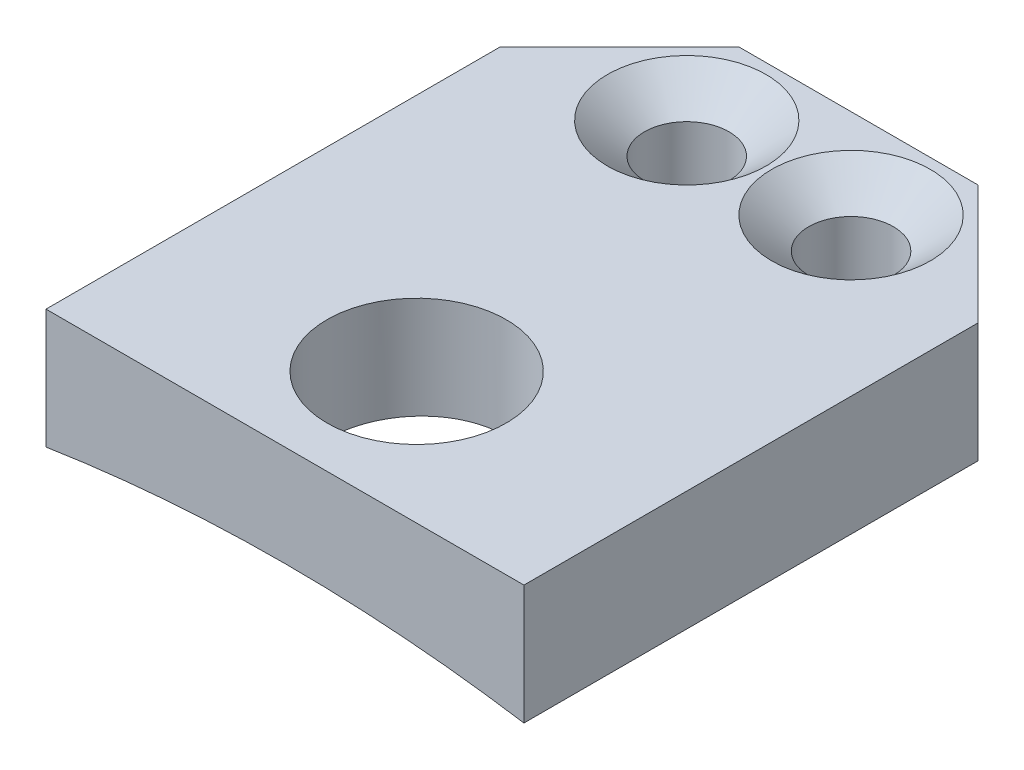
ISO-10303-21;
HEADER;
FILE_DESCRIPTION(('STEP AP214'),'2;1');
FILE_NAME('part.step','',(''),(''),'','','');
FILE_SCHEMA(('AUTOMOTIVE_DESIGN { 1 0 10303 214 1 1 1 1 }'));
ENDSEC;
DATA;
#1=APPLICATION_CONTEXT('core data for automotive mechanical design processes');
#2=APPLICATION_PROTOCOL_DEFINITION('international standard','automotive_design',2000,#1);
#3=PRODUCT_CONTEXT('',#1,'mechanical');
#4=PRODUCT('Part','Part','',(#3));
#5=PRODUCT_RELATED_PRODUCT_CATEGORY('part','',(#4));
#6=PRODUCT_DEFINITION_FORMATION('','',#4);
#7=PRODUCT_DEFINITION_CONTEXT('part definition',#1,'design');
#8=PRODUCT_DEFINITION('design','',#6,#7);
#9=PRODUCT_DEFINITION_SHAPE('','',#8);
#10=(LENGTH_UNIT() NAMED_UNIT(*) SI_UNIT(.MILLI.,.METRE.));
#11=(NAMED_UNIT(*) PLANE_ANGLE_UNIT() SI_UNIT($,.RADIAN.));
#12=(NAMED_UNIT(*) SI_UNIT($,.STERADIAN.) SOLID_ANGLE_UNIT());
#13=UNCERTAINTY_MEASURE_WITH_UNIT(LENGTH_MEASURE(1.E-05),#10,'distance_accuracy_value','');
#14=(GEOMETRIC_REPRESENTATION_CONTEXT(3) GLOBAL_UNCERTAINTY_ASSIGNED_CONTEXT((#13)) GLOBAL_UNIT_ASSIGNED_CONTEXT((#10,
#11,#12)) REPRESENTATION_CONTEXT('',''));
#15=CARTESIAN_POINT('',(0.,0.,0.));
#16=DIRECTION('',(0.,0.,1.));
#17=DIRECTION('',(1.,0.,0.));
#18=AXIS2_PLACEMENT_3D('',#15,#16,#17);
#19=CARTESIAN_POINT('',(-9.46182569861947,6.35,-17.9252711134383));
#20=DIRECTION('',(-0.707106781186547,0.,0.707106781186548));
#21=DIRECTION('',(0.707106781186548,0.,0.707106781186547));
#22=AXIS2_PLACEMENT_3D('',#19,#20,#21);
#23=PLANE('',#22);
#24=DIRECTION('',(0.,-1.,0.));
#25=VECTOR('',#24,1.);
#26=CARTESIAN_POINT('',(-3.11182569861947,6.35,-11.5752711134383));
#27=LINE('',#26,#25);
#28=CARTESIAN_POINT('',(-3.11182569861947,6.35,-11.5752711134383));
#29=VERTEX_POINT('',#28);
#30=CARTESIAN_POINT('',(-3.11182569861947,0.,-11.5752711134383));
#31=VERTEX_POINT('',#30);
#32=EDGE_CURVE('E106',#29,#31,#27,.T.);
#33=ORIENTED_EDGE('',*,*,#32,.T.);
#34=CARTESIAN_POINT('',(-15.8118256986195,-81.0530675792101,-24.2752711134383));
#35=DIRECTION('',(-0.707106781186547,0.,0.707106781186548));
#36=DIRECTION('',(0.707106781186548,0.,0.707106781186547));
#37=AXIS2_PLACEMENT_3D('',#34,#35,#36);
#38=ELLIPSE('',#37,116.024909084213,82.042);
#39=CARTESIAN_POINT('',(-9.46182569861947,0.742820239188202,-17.9252711134383));
#40=VERTEX_POINT('',#39);
#41=EDGE_CURVE('E92',#31,#40,#38,.T.);
#42=ORIENTED_EDGE('',*,*,#41,.T.);
#43=DIRECTION('',(0.,-1.,0.));
#44=VECTOR('',#43,1.);
#45=CARTESIAN_POINT('',(-9.46182569861947,6.35,-17.9252711134383));
#46=LINE('',#45,#44);
#47=CARTESIAN_POINT('',(-9.46182569861947,6.35,-17.9252711134383));
#48=VERTEX_POINT('',#47);
#49=EDGE_CURVE('E11',#48,#40,#46,.T.);
#50=ORIENTED_EDGE('',*,*,#49,.F.);
#51=DIRECTION('',(-0.707106781186548,0.,-0.707106781186547));
#52=VECTOR('',#51,1.);
#53=CARTESIAN_POINT('',(-9.46182569861947,6.35,-17.9252711134383));
#54=LINE('',#53,#52);
#55=EDGE_CURVE('E113',#29,#48,#54,.T.);
#56=ORIENTED_EDGE('',*,*,#55,.F.);
#57=EDGE_LOOP('',(#33,#42,#50,#56));
#58=FACE_BOUND('',#57,.T.);
#59=ADVANCED_FACE('F35',(#58),#23,.F.);
#60=CARTESIAN_POINT('',(-22.1618256986195,6.35,-17.9252711134383));
#61=DIRECTION('',(0.,0.,1.));
#62=DIRECTION('',(1.,0.,0.));
#63=AXIS2_PLACEMENT_3D('',#60,#61,#62);
#64=PLANE('',#63);
#65=ORIENTED_EDGE('',*,*,#49,.T.);
#66=CARTESIAN_POINT('',(-15.8118256986195,-81.0530675792101,-17.9252711134383));
#67=DIRECTION('',(0.,0.,1.));
#68=DIRECTION('',(1.,0.,0.));
#69=AXIS2_PLACEMENT_3D('',#66,#67,#68);
#70=CIRCLE('',#69,82.042);
#71=CARTESIAN_POINT('',(-22.1618256986195,0.742820239188202,-17.9252711134383));
#72=VERTEX_POINT('',#71);
#73=EDGE_CURVE('E89',#40,#72,#70,.T.);
#74=ORIENTED_EDGE('',*,*,#73,.T.);
#75=DIRECTION('',(0.,-1.,0.));
#76=VECTOR('',#75,1.);
#77=CARTESIAN_POINT('',(-22.1618256986195,6.35,-17.9252711134383));
#78=LINE('',#77,#76);
#79=CARTESIAN_POINT('',(-22.1618256986195,6.35,-17.9252711134383));
#80=VERTEX_POINT('',#79);
#81=EDGE_CURVE('E48',#80,#72,#78,.T.);
#82=ORIENTED_EDGE('',*,*,#81,.F.);
#83=DIRECTION('',(-1.,0.,0.));
#84=VECTOR('',#83,1.);
#85=CARTESIAN_POINT('',(-22.1618256986195,6.35,-17.9252711134383));
#86=LINE('',#85,#84);
#87=EDGE_CURVE('E110',#48,#80,#86,.T.);
#88=ORIENTED_EDGE('',*,*,#87,.F.);
#89=EDGE_LOOP('',(#65,#74,#82,#88));
#90=FACE_BOUND('',#89,.T.);
#91=ADVANCED_FACE('F109',(#90),#64,.F.);
#92=CARTESIAN_POINT('',(-28.5118256986195,6.35,-11.5752711134383));
#93=DIRECTION('',(0.707106781186547,0.,0.707106781186548));
#94=DIRECTION('',(0.707106781186548,0.,-0.707106781186547));
#95=AXIS2_PLACEMENT_3D('',#92,#93,#94);
#96=PLANE('',#95);
#97=ORIENTED_EDGE('',*,*,#81,.T.);
#98=CARTESIAN_POINT('',(-15.8118256986195,-81.0530675792101,-24.2752711134383));
#99=DIRECTION('',(0.707106781186547,0.,0.707106781186548));
#100=DIRECTION('',(-0.707106781186548,0.,0.707106781186547));
#101=AXIS2_PLACEMENT_3D('',#98,#99,#100);
#102=ELLIPSE('',#101,116.024909084213,82.042);
#103=CARTESIAN_POINT('',(-28.5118256986195,0.,-11.5752711134383));
#104=VERTEX_POINT('',#103);
#105=EDGE_CURVE('E95',#72,#104,#102,.T.);
#106=ORIENTED_EDGE('',*,*,#105,.T.);
#107=DIRECTION('',(0.,-1.,0.));
#108=VECTOR('',#107,1.);
#109=CARTESIAN_POINT('',(-28.5118256986195,6.35,-11.5752711134383));
#110=LINE('',#109,#108);
#111=CARTESIAN_POINT('',(-28.5118256986195,6.35,-11.5752711134383));
#112=VERTEX_POINT('',#111);
#113=EDGE_CURVE('E139',#112,#104,#110,.T.);
#114=ORIENTED_EDGE('',*,*,#113,.F.);
#115=DIRECTION('',(-0.707106781186548,0.,0.707106781186547));
#116=VECTOR('',#115,1.);
#117=CARTESIAN_POINT('',(-28.5118256986195,6.35,-11.5752711134383));
#118=LINE('',#117,#116);
#119=EDGE_CURVE('E112',#80,#112,#118,.T.);
#120=ORIENTED_EDGE('',*,*,#119,.F.);
#121=EDGE_LOOP('',(#97,#106,#114,#120));
#122=FACE_BOUND('',#121,.T.);
#123=ADVANCED_FACE('F185',(#122),#96,.F.);
#124=CARTESIAN_POINT('',(-28.5118256986195,6.35,-11.5752711134383));
#125=DIRECTION('',(1.,0.,0.));
#126=DIRECTION('',(0.,0.,-1.));
#127=AXIS2_PLACEMENT_3D('',#124,#125,#126);
#128=PLANE('',#127);
#129=DIRECTION('',(0.,0.,1.));
#130=VECTOR('',#129,1.);
#131=CARTESIAN_POINT('',(-28.5118256986195,0.,-11.5752711134383));
#132=LINE('',#131,#130);
#133=CARTESIAN_POINT('',(-28.5118256986195,0.,12.5547288865617));
#134=VERTEX_POINT('',#133);
#135=EDGE_CURVE('E118',#104,#134,#132,.T.);
#136=ORIENTED_EDGE('',*,*,#135,.T.);
#137=DIRECTION('',(0.,-1.,0.));
#138=VECTOR('',#137,1.);
#139=CARTESIAN_POINT('',(-28.5118256986195,6.35,12.5547288865617));
#140=LINE('',#139,#138);
#141=CARTESIAN_POINT('',(-28.5118256986195,6.35,12.5547288865617));
#142=VERTEX_POINT('',#141);
#143=EDGE_CURVE('E136',#142,#134,#140,.T.);
#144=ORIENTED_EDGE('',*,*,#143,.F.);
#145=DIRECTION('',(0.,0.,1.));
#146=VECTOR('',#145,1.);
#147=CARTESIAN_POINT('',(-28.5118256986195,6.35,-11.5752711134383));
#148=LINE('',#147,#146);
#149=EDGE_CURVE('E125',#112,#142,#148,.T.);
#150=ORIENTED_EDGE('',*,*,#149,.F.);
#151=ORIENTED_EDGE('',*,*,#113,.T.);
#152=EDGE_LOOP('',(#136,#144,#150,#151));
#153=FACE_BOUND('',#152,.T.);
#154=ADVANCED_FACE('F181',(#153),#128,.F.);
#155=CARTESIAN_POINT('',(-28.5118256986195,6.35,12.5547288865617));
#156=DIRECTION('',(0.,0.,-1.));
#157=DIRECTION('',(-1.,0.,0.));
#158=AXIS2_PLACEMENT_3D('',#155,#156,#157);
#159=PLANE('',#158);
#160=ORIENTED_EDGE('',*,*,#143,.T.);
#161=CARTESIAN_POINT('',(-15.8118256986195,-81.0530675792101,12.5547288865617));
#162=DIRECTION('',(0.,0.,1.));
#163=DIRECTION('',(1.,0.,0.));
#164=AXIS2_PLACEMENT_3D('',#161,#162,#163);
#165=CIRCLE('',#164,82.042);
#166=CARTESIAN_POINT('',(-3.11182569861945,0.,12.5547288865617));
#167=VERTEX_POINT('',#166);
#168=EDGE_CURVE('E100',#167,#134,#165,.T.);
#169=ORIENTED_EDGE('',*,*,#168,.F.);
#170=DIRECTION('',(0.,-1.,0.));
#171=VECTOR('',#170,1.);
#172=CARTESIAN_POINT('',(-3.11182569861948,6.35,12.5547288865617));
#173=LINE('',#172,#171);
#174=CARTESIAN_POINT('',(-3.11182569861948,6.35,12.5547288865617));
#175=VERTEX_POINT('',#174);
#176=EDGE_CURVE('E133',#175,#167,#173,.T.);
#177=ORIENTED_EDGE('',*,*,#176,.F.);
#178=DIRECTION('',(1.,0.,0.));
#179=VECTOR('',#178,1.);
#180=CARTESIAN_POINT('',(-28.5118256986195,6.35,12.5547288865617));
#181=LINE('',#180,#179);
#182=EDGE_CURVE('E127',#142,#175,#181,.T.);
#183=ORIENTED_EDGE('',*,*,#182,.F.);
#184=EDGE_LOOP('',(#160,#169,#177,#183));
#185=FACE_BOUND('',#184,.T.);
#186=ADVANCED_FACE('F177',(#185),#159,.F.);
#187=CARTESIAN_POINT('',(-3.11182569861947,6.35,-11.5752711134383));
#188=DIRECTION('',(-1.,0.,0.));
#189=DIRECTION('',(0.,0.,1.));
#190=AXIS2_PLACEMENT_3D('',#187,#188,#189);
#191=PLANE('',#190);
#192=DIRECTION('',(0.,0.,-1.));
#193=VECTOR('',#192,1.);
#194=CARTESIAN_POINT('',(-3.11182569861947,0.,-11.5752711134383));
#195=LINE('',#194,#193);
#196=EDGE_CURVE('E116',#167,#31,#195,.T.);
#197=ORIENTED_EDGE('',*,*,#196,.T.);
#198=ORIENTED_EDGE('',*,*,#32,.F.);
#199=DIRECTION('',(0.,0.,-1.));
#200=VECTOR('',#199,1.);
#201=CARTESIAN_POINT('',(-3.11182569861947,6.35,-11.5752711134383));
#202=LINE('',#201,#200);
#203=EDGE_CURVE('E56',#175,#29,#202,.T.);
#204=ORIENTED_EDGE('',*,*,#203,.F.);
#205=ORIENTED_EDGE('',*,*,#176,.T.);
#206=EDGE_LOOP('',(#197,#198,#204,#205));
#207=FACE_BOUND('',#206,.T.);
#208=ADVANCED_FACE('F173',(#207),#191,.F.);
#209=CARTESIAN_POINT('',(0.,6.35,0.));
#210=DIRECTION('',(0.,1.,0.));
#211=DIRECTION('',(0.,0.,1.));
#212=AXIS2_PLACEMENT_3D('',#209,#210,#211);
#213=PLANE('',#212);
#214=CARTESIAN_POINT('',(-15.7993805032458,6.35,5.5697288865617));
#215=DIRECTION('',(0.,1.,0.));
#216=DIRECTION('',(0.,0.,1.));
#217=AXIS2_PLACEMENT_3D('',#214,#215,#216);
#218=CIRCLE('',#217,4.7625);
#219=CARTESIAN_POINT('',(-15.7993805032458,6.35,10.3322288865617));
#220=VERTEX_POINT('',#219);
#221=EDGE_CURVE('E273',#220,#220,#218,.T.);
#222=ORIENTED_EDGE('',*,*,#221,.F.);
#223=EDGE_LOOP('',(#222));
#224=FACE_BOUND('',#223,.T.);
#225=CARTESIAN_POINT('',(-20.1774506986195,6.35,-13.1627711134383));
#226=DIRECTION('',(0.,1.,0.));
#227=DIRECTION('',(0.,0.,1.));
#228=AXIS2_PLACEMENT_3D('',#225,#226,#227);
#229=CIRCLE('',#228,4.2164);
#230=CARTESIAN_POINT('',(-20.1774506986195,6.35,-8.94637111343829));
#231=VERTEX_POINT('',#230);
#232=EDGE_CURVE('E283',#231,#231,#229,.T.);
#233=ORIENTED_EDGE('',*,*,#232,.F.);
#234=EDGE_LOOP('',(#233));
#235=FACE_BOUND('',#234,.T.);
#236=CARTESIAN_POINT('',(-11.4462006986195,6.35,-13.1627711134383));
#237=DIRECTION('',(0.,1.,0.));
#238=DIRECTION('',(0.,0.,1.));
#239=AXIS2_PLACEMENT_3D('',#236,#237,#238);
#240=CIRCLE('',#239,4.2164);
#241=CARTESIAN_POINT('',(-11.4462006986195,6.35,-8.94637111343829));
#242=VERTEX_POINT('',#241);
#243=EDGE_CURVE('E289',#242,#242,#240,.T.);
#244=ORIENTED_EDGE('',*,*,#243,.F.);
#245=EDGE_LOOP('',(#244));
#246=FACE_BOUND('',#245,.T.);
#247=ORIENTED_EDGE('',*,*,#55,.T.);
#248=ORIENTED_EDGE('',*,*,#87,.T.);
#249=ORIENTED_EDGE('',*,*,#119,.T.);
#250=ORIENTED_EDGE('',*,*,#149,.T.);
#251=ORIENTED_EDGE('',*,*,#182,.T.);
#252=ORIENTED_EDGE('',*,*,#203,.T.);
#253=EDGE_LOOP('',(#247,#248,#249,#250,#251,#252));
#254=FACE_BOUND('',#253,.T.);
#255=ADVANCED_FACE('F115',(#224,#235,#246,#254),#213,.T.);
#256=CARTESIAN_POINT('',(-11.4462006986195,6.35,-13.1627711134383));
#257=DIRECTION('',(0.,1.,0.));
#258=DIRECTION('',(0.,0.,1.));
#259=AXIS2_PLACEMENT_3D('',#256,#257,#258);
#260=CYLINDRICAL_SURFACE('',#259,2.2479);
#261=CARTESIAN_POINT('',(-11.4462006986195,0.872698101431396,-10.9148711134383));
#262=CARTESIAN_POINT('',(-11.5724581183139,0.879425637600338,-10.9148766645662));
#263=CARTESIAN_POINT('',(-11.6988214219175,0.885863819395868,-10.9255436844624));
#264=CARTESIAN_POINT('',(-11.9481006299543,0.897997193573876,-10.9679655683311));
#265=CARTESIAN_POINT('',(-12.0710122927471,0.903691500717502,-10.9997452885172));
#266=CARTESIAN_POINT('',(-12.30974180428,0.914239587095616,-11.0835070036873));
#267=CARTESIAN_POINT('',(-12.4255625844459,0.919093715203898,-11.1354805841939));
#268=CARTESIAN_POINT('',(-12.6468185887368,0.9279349093391,-11.2581529692462));
#269=CARTESIAN_POINT('',(-12.7522563614403,0.931922188431547,-11.3288471628969));
#270=CARTESIAN_POINT('',(-12.9496916637995,0.93905229089963,-11.4868994293524));
#271=CARTESIAN_POINT('',(-13.0417000331939,0.942195797077884,-11.5742439298104));
#272=CARTESIAN_POINT('',(-13.209756100012,0.947701234511881,-11.7631602612973));
#273=CARTESIAN_POINT('',(-13.285803235907,0.950063138271924,-11.8647325926628));
#274=CARTESIAN_POINT('',(-13.419720203529,0.954079043997791,-12.0791467827732));
#275=CARTESIAN_POINT('',(-13.4776017587191,0.955733502776102,-12.191981311032));
#276=CARTESIAN_POINT('',(-13.5736061569461,0.95841001380811,-12.4257711213163));
#277=CARTESIAN_POINT('',(-13.6117290600956,0.959432067985798,-12.5467263786346));
#278=CARTESIAN_POINT('',(-13.6671269050084,0.960899566762265,-12.79330381664));
#279=CARTESIAN_POINT('',(-13.6844051052413,0.961345101484059,-12.9189252647368));
#280=CARTESIAN_POINT('',(-13.6976329461185,0.961687183721576,-13.1712866539029));
#281=CARTESIAN_POINT('',(-13.693582627193,0.961583732277952,-13.2980265928516));
#282=CARTESIAN_POINT('',(-13.6642688761045,0.960821331011286,-13.5490259314342));
#283=CARTESIAN_POINT('',(-13.6390056778757,0.960162387314176,-13.6732853584076));
#284=CARTESIAN_POINT('',(-13.5679851387957,0.958249901708089,-13.9157978380152));
#285=CARTESIAN_POINT('',(-13.5222277845099,0.956996359409332,-14.0340508867121));
#286=CARTESIAN_POINT('',(-13.4115210719134,0.953830623766153,-14.2611939456722));
#287=CARTESIAN_POINT('',(-13.3465716979642,0.951918429885034,-14.3700839483061));
#288=CARTESIAN_POINT('',(-13.19933029137,0.947359483845598,-14.5754107711855));
#289=CARTESIAN_POINT('',(-13.1170382788714,0.944712732540599,-14.6718476058974));
#290=CARTESIAN_POINT('',(-12.9374488982723,0.938613556678886,-14.849540543517));
#291=CARTESIAN_POINT('',(-12.840150471379,0.935161075264243,-14.9307955743618));
#292=CARTESIAN_POINT('',(-12.6333237127185,0.927403145968794,-15.0758172724484));
#293=CARTESIAN_POINT('',(-12.5237953717206,0.923097697444191,-15.1395839264902));
#294=CARTESIAN_POINT('',(-12.2955792555187,0.9136257065847,-15.2478534016257));
#295=CARTESIAN_POINT('',(-12.1768877972409,0.908458817019663,-15.2923484285752));
#296=CARTESIAN_POINT('',(-11.9337582145644,0.897314701386124,-15.3607910183628));
#297=CARTESIAN_POINT('',(-11.8093200608592,0.891337471184826,-15.3847384764023));
#298=CARTESIAN_POINT('',(-11.5580938480582,0.878680603697286,-15.4114391383306));
#299=CARTESIAN_POINT('',(-11.4313034679794,0.872000238519722,-15.4141701556569));
#300=CARTESIAN_POINT('',(-11.1790905218646,0.858125079513195,-15.3983186345502));
#301=CARTESIAN_POINT('',(-11.0536679690552,0.850930280714862,-15.3797358902026));
#302=CARTESIAN_POINT('',(-10.8075547826105,0.836261784522394,-15.3217506089936));
#303=CARTESIAN_POINT('',(-10.6868713044229,0.828787696310199,-15.2823177983742));
#304=CARTESIAN_POINT('',(-10.4538439546506,0.81386983067178,-15.1837332515051));
#305=CARTESIAN_POINT('',(-10.3415001434442,0.806426053465372,-15.1245813725081));
#306=CARTESIAN_POINT('',(-10.1282522055221,0.791896858301839,-14.9881747693509));
#307=CARTESIAN_POINT('',(-10.0273568163772,0.784811716313394,-14.9109063545187));
#308=CARTESIAN_POINT('',(-9.83997527382721,0.771351814859461,-14.7404701026886));
#309=CARTESIAN_POINT('',(-9.75348906917814,0.764977052867647,-14.6473023222366));
#310=CARTESIAN_POINT('',(-9.59748733925758,0.753276266055408,-14.4478114795591));
#311=CARTESIAN_POINT('',(-9.52795309661674,0.747949085825037,-14.3415031237173));
#312=CARTESIAN_POINT('',(-9.40773229856061,0.738625173838021,-14.1186622827986));
#313=CARTESIAN_POINT('',(-9.35704542282599,0.734628419470323,-14.0021299715239));
#314=CARTESIAN_POINT('',(-9.27609806509442,0.728199737911043,-13.762488285319));
#315=CARTESIAN_POINT('',(-9.24578227688697,0.725763574661006,-13.6393977056105));
#316=CARTESIAN_POINT('',(-9.20623504029563,0.722578771167085,-13.3898538800207));
#317=CARTESIAN_POINT('',(-9.19700329278781,0.721830106982283,-13.2634006818712));
#318=CARTESIAN_POINT('',(-9.19988852747736,0.722063432538817,-13.011039973277));
#319=CARTESIAN_POINT('',(-9.21195510348585,0.72304133605882,-12.8851318794836));
#320=CARTESIAN_POINT('',(-9.25698967825133,0.72666335809898,-12.6371362903155));
#321=CARTESIAN_POINT('',(-9.28995766637563,0.729307475771522,-12.5150487929971));
#322=CARTESIAN_POINT('',(-9.37584434276311,0.736111112891668,-12.2781503742084));
#323=CARTESIAN_POINT('',(-9.42876328546707,0.740270651665889,-12.1633395455616));
#324=CARTESIAN_POINT('',(-9.55303285860266,0.749873340099736,-11.9442341977951));
#325=CARTESIAN_POINT('',(-9.62438299730835,0.755316455514481,-11.8399393982214));
#326=CARTESIAN_POINT('',(-9.78366447719345,0.767207479619972,-11.6445650843856));
#327=CARTESIAN_POINT('',(-9.87163268205028,0.77365761654681,-11.553515762812));
#328=CARTESIAN_POINT('',(-10.0615781289859,0.787224839733688,-11.3874424845286));
#329=CARTESIAN_POINT('',(-10.1635590333053,0.79434210019243,-11.31242273031));
#330=CARTESIAN_POINT('',(-10.3789643661633,0.808922771948947,-11.1803279235686));
#331=CARTESIAN_POINT('',(-10.4924243857954,0.816387218497159,-11.1233110897847));
#332=CARTESIAN_POINT('',(-10.7272219744221,0.831304251122724,-11.0292096551925));
#333=CARTESIAN_POINT('',(-10.8485500646417,0.838756840783999,-10.9921015522858));
#334=CARTESIAN_POINT('',(-11.0498957437067,0.850655807248458,-10.9486449892891));
#335=CARTESIAN_POINT('',(-11.1286040037051,0.85519503060921,-10.9359966273701));
#336=CARTESIAN_POINT('',(-11.2869276921631,0.864093929345696,-10.9191079332467));
#337=CARTESIAN_POINT('',(-11.3665431217136,0.868453604505499,-10.9148676111538));
#338=CARTESIAN_POINT('',(-11.4462006986195,0.872698101431396,-10.9148711134383));
#339=B_SPLINE_CURVE_WITH_KNOTS('',3,(#261,#262,#263,#264,#265,#266,#267,#268,#269,#270,#271,
#272,#273,#274,#275,#276,#277,#278,#279,#280,#281,#282,#283,#284,#285,#286,#287,#288,#289,#290,
#291,#292,#293,#294,#295,#296,#297,#298,#299,#300,#301,#302,#303,#304,#305,#306,#307,#308,#309,
#310,#311,#312,#313,#314,#315,#316,#317,#318,#319,#320,#321,#322,#323,#324,#325,#326,#327,#328,
#329,#330,#331,#332,#333,#334,#335,#336,#337,#338),.UNSPECIFIED.,.T.,.F.,(4,2,2,2,2,2,2,2,2,2,2,
2,2,2,2,2,2,2,2,2,2,2,2,2,2,2,2,2,2,2,2,2,2,2,2,2,2,2,4),(0.,0.379019055720341,
0.758485127379132,1.13779325052111,1.51700803666363,1.89591502097083,2.27483533328939,
2.65351059773706,3.03218471011889,3.41079962002715,3.78941381223675,4.1680238291692,
4.54663409429457,4.92524466792812,5.30385480173993,5.68249166100322,6.06112880605328,
6.43991894301241,6.818711011901,7.19789913987857,7.57709093126599,7.95683481739982,
8.33658145257806,8.71661599266407,9.09664918118931,9.47626083921482,9.85586604527772,
10.2344364377677,10.6130014593627,10.9906717418898,11.3683418322937,11.7460167394055,
12.1236815715678,12.5021942260769,12.8808059942815,13.260629885058,13.6400044046242,
13.8791325552264,14.1182609934039),.UNSPECIFIED.);
#340=CARTESIAN_POINT('',(-11.4462006986195,0.872698101431396,-10.9148711134383));
#341=VERTEX_POINT('',#340);
#342=EDGE_CURVE('E107',#341,#341,#339,.T.);
#343=ORIENTED_EDGE('',*,*,#342,.T.);
#344=EDGE_LOOP('',(#343));
#345=FACE_BOUND('',#344,.T.);
#346=CARTESIAN_POINT('',(-11.4462006986195,4.69823237602752,-13.1627711134383));
#347=DIRECTION('',(0.,1.,0.));
#348=DIRECTION('',(0.,0.,1.));
#349=AXIS2_PLACEMENT_3D('',#346,#347,#348);
#350=CIRCLE('',#349,2.2479);
#351=CARTESIAN_POINT('',(-11.4462006986195,4.69823237602752,-10.9148711134383));
#352=VERTEX_POINT('',#351);
#353=EDGE_CURVE('E121',#352,#352,#350,.T.);
#354=ORIENTED_EDGE('',*,*,#353,.T.);
#355=EDGE_LOOP('',(#354));
#356=FACE_BOUND('',#355,.T.);
#357=ADVANCED_FACE('F165',(#345,#356),#260,.F.);
#358=CARTESIAN_POINT('',(-11.4462006986195,6.35,-13.1627711134383));
#359=DIRECTION('',(0.,1.,0.));
#360=DIRECTION('',(0.,0.,1.));
#361=AXIS2_PLACEMENT_3D('',#358,#359,#360);
#362=CONICAL_SURFACE('',#361,4.2164,0.872664625997165);
#363=ORIENTED_EDGE('',*,*,#353,.F.);
#364=EDGE_LOOP('',(#363));
#365=FACE_BOUND('',#364,.T.);
#366=ORIENTED_EDGE('',*,*,#243,.T.);
#367=EDGE_LOOP('',(#366));
#368=FACE_BOUND('',#367,.T.);
#369=ADVANCED_FACE('F169',(#365,#368),#362,.F.);
#370=CARTESIAN_POINT('',(-20.1774506986195,6.35,-13.1627711134383));
#371=DIRECTION('',(0.,1.,0.));
#372=DIRECTION('',(0.,0.,1.));
#373=AXIS2_PLACEMENT_3D('',#370,#371,#372);
#374=CYLINDRICAL_SURFACE('',#373,2.2479);
#375=CARTESIAN_POINT('',(-20.1774506986195,0.872698101431396,-10.9148711134383));
#376=CARTESIAN_POINT('',(-20.3039396936585,0.865957389921815,-10.9148767113696));
#377=CARTESIAN_POINT('',(-20.4305046797878,0.858916543249472,-10.9255830615832));
#378=CARTESIAN_POINT('',(-20.6801174654794,0.84446097125073,-10.9681306648842));
#379=CARTESIAN_POINT('',(-20.8031608090844,0.837045802453302,-10.9999975575457));
#380=CARTESIAN_POINT('',(-21.0420820669717,0.822133204373354,-11.0839529954787));
#381=CARTESIAN_POINT('',(-21.1579635178125,0.814635817878872,-11.1360314662314));
#382=CARTESIAN_POINT('',(-21.3793006765673,0.799881696799906,-11.2589242571636));
#383=CARTESIAN_POINT('',(-21.4847589704037,0.792624902824273,-11.3297339141404));
#384=CARTESIAN_POINT('',(-21.6823164653367,0.778692318354974,-11.4881175028769));
#385=CARTESIAN_POINT('',(-21.7744125810063,0.772016662192271,-11.5756952957299));
#386=CARTESIAN_POINT('',(-21.9425896588724,0.759588085003796,-11.7651366329887));
#387=CARTESIAN_POINT('',(-22.0186701177385,0.753835192979451,-11.867000626205));
#388=CARTESIAN_POINT('',(-22.1525071548779,0.743570717731535,-12.0819355893385));
#389=CARTESIAN_POINT('',(-22.2102957803573,0.739056965403599,-12.1949864984054));
#390=CARTESIAN_POINT('',(-22.30606267009,0.731509031503,-12.4292348197854));
#391=CARTESIAN_POINT('',(-22.3440413243935,0.728474820798858,-12.5504320716474));
#392=CARTESIAN_POINT('',(-22.3990066943122,0.724066000530676,-12.7971597479761));
#393=CARTESIAN_POINT('',(-22.4160533813828,0.72268664994597,-12.9226767288896));
#394=CARTESIAN_POINT('',(-22.4288594735574,0.72165144528841,-13.1747980743484));
#395=CARTESIAN_POINT('',(-22.42461918946,0.721995566052162,-13.3014024229909));
#396=CARTESIAN_POINT('',(-22.3950015984308,0.724385146912184,-13.5518693284217));
#397=CARTESIAN_POINT('',(-22.3696616352258,0.726427601167126,-13.6757363326398));
#398=CARTESIAN_POINT('',(-22.2986254244029,0.732092763720938,-13.9174500743962));
#399=CARTESIAN_POINT('',(-22.2529291001783,0.735715477966781,-14.0352967892766));
#400=CARTESIAN_POINT('',(-22.1424451733881,0.744341173148878,-14.2617414653785));
#401=CARTESIAN_POINT('',(-22.0776412630799,0.749345332873292,-14.3703314237679));
#402=CARTESIAN_POINT('',(-21.9308073538746,0.76045960575641,-14.5750982727012));
#403=CARTESIAN_POINT('',(-21.8487771048567,0.766569734973256,-14.6712749829761));
#404=CARTESIAN_POINT('',(-21.6695704477066,0.779594996730358,-14.8487666067653));
#405=CARTESIAN_POINT('',(-21.5723533127451,0.786512280823369,-14.9300402421078));
#406=CARTESIAN_POINT('',(-21.3656886740314,0.800796600505047,-15.0751218475671));
#407=CARTESIAN_POINT('',(-21.2562409928406,0.808163642618017,-15.1389295642451));
#408=CARTESIAN_POINT('',(-21.0279306746938,0.823028536276451,-15.2474172568228));
#409=CARTESIAN_POINT('',(-20.9090462884313,0.830526657005732,-15.29205143101));
#410=CARTESIAN_POINT('',(-20.6654552445181,0.845326319955621,-15.3607061994462));
#411=CARTESIAN_POINT('',(-20.5407485637839,0.852627861396671,-15.3847267119609));
#412=CARTESIAN_POINT('',(-20.2889845114631,0.866775636820155,-15.4114701113975));
#413=CARTESIAN_POINT('',(-20.1619260330759,0.873621649080037,-15.4141827010893));
#414=CARTESIAN_POINT('',(-19.9091296326464,0.88665346966696,-15.3981901712099));
#415=CARTESIAN_POINT('',(-19.7833917034911,0.892839281551742,-15.379485167062));
#416=CARTESIAN_POINT('',(-19.5369589709634,0.904411358598624,-15.3212053386611));
#417=CARTESIAN_POINT('',(-19.416258703071,0.90979850719462,-15.281653797656));
#418=CARTESIAN_POINT('',(-19.1831965999508,0.919715952983053,-15.182804549451));
#419=CARTESIAN_POINT('',(-19.070834700809,0.924246256743654,-15.1235069936243));
#420=CARTESIAN_POINT('',(-18.857811637976,0.932437829806228,-14.9869399959465));
#421=CARTESIAN_POINT('',(-18.7571342067035,0.936100314908382,-14.9096960010805));
#422=CARTESIAN_POINT('',(-18.5701699293308,0.942603464441501,-14.7393793554561));
#423=CARTESIAN_POINT('',(-18.4838830222623,0.945444132354291,-14.646306771762));
#424=CARTESIAN_POINT('',(-18.3282280234704,0.950368692926079,-14.4470602646307));
#425=CARTESIAN_POINT('',(-18.2588458515408,0.95245321610166,-14.3408973561025));
#426=CARTESIAN_POINT('',(-18.1388835762803,0.955945234474736,-14.1184226578115));
#427=CARTESIAN_POINT('',(-18.0883034233125,0.957352731459567,-14.0021108948425));
#428=CARTESIAN_POINT('',(-18.0073962805224,0.959558783254948,-13.7626736938299));
#429=CARTESIAN_POINT('',(-17.9770639181038,0.960357499608764,-13.6395500726579));
#430=CARTESIAN_POINT('',(-17.9374937328609,0.961392713776732,-13.3899559707056));
#431=CARTESIAN_POINT('',(-17.9282559419731,0.961629210739697,-13.2634854848585));
#432=CARTESIAN_POINT('',(-17.9311377385721,0.96155478845122,-13.0107926301601));
#433=CARTESIAN_POINT('',(-17.943256589131,0.961243888088155,-12.8845702528979));
#434=CARTESIAN_POINT('',(-17.9885055859996,0.96005535867291,-12.6359520600344));
#435=CARTESIAN_POINT('',(-18.0216357698683,0.959177728607663,-12.5135562512737));
#436=CARTESIAN_POINT('',(-18.1079655835706,0.956805959765983,-12.2760637184977));
#437=CARTESIAN_POINT('',(-18.1611655798496,0.955311809732748,-12.1609671278003));
#438=CARTESIAN_POINT('',(-18.2861184598899,0.951636729943758,-11.9413467645554));
#439=CARTESIAN_POINT('',(-18.3578706059606,0.949455827494646,-11.8368225718467));
#440=CARTESIAN_POINT('',(-18.5178786021822,0.944331345125858,-11.6413142246304));
#441=CARTESIAN_POINT('',(-18.6061332446011,0.941387821012429,-11.5503290801447));
#442=CARTESIAN_POINT('',(-18.7966644130748,0.934672775141119,-11.3844461021581));
#443=CARTESIAN_POINT('',(-18.8989443939418,0.930901049237138,-11.3095522440705));
#444=CARTESIAN_POINT('',(-19.1146601328164,0.922494027696268,-11.1779505583742));
#445=CARTESIAN_POINT('',(-19.2281040400363,0.917858098985706,-11.1212561462202));
#446=CARTESIAN_POINT('',(-19.4627734801991,0.907740616985861,-11.0277753073306));
#447=CARTESIAN_POINT('',(-19.5839895823657,0.902260077618046,-10.9909652458353));
#448=CARTESIAN_POINT('',(-19.7845513168744,0.892726876876484,-10.9480618459298));
#449=CARTESIAN_POINT('',(-19.8626091253394,0.888906355603765,-10.9356298100024));
#450=CARTESIAN_POINT('',(-20.0195849878651,0.880995563423162,-10.9190326976667));
#451=CARTESIAN_POINT('',(-20.0985030417438,0.876905292572351,-10.9148676195093));
#452=CARTESIAN_POINT('',(-20.1774506986195,0.872698101431396,-10.9148711134383));
#453=B_SPLINE_CURVE_WITH_KNOTS('',3,(#375,#376,#377,#378,#379,#380,#381,#382,#383,#384,#385,
#386,#387,#388,#389,#390,#391,#392,#393,#394,#395,#396,#397,#398,#399,#400,#401,#402,#403,#404,
#405,#406,#407,#408,#409,#410,#411,#412,#413,#414,#415,#416,#417,#418,#419,#420,#421,#422,#423,
#424,#425,#426,#427,#428,#429,#430,#431,#432,#433,#434,#435,#436,#437,#438,#439,#440,#441,#442,
#443,#444,#445,#446,#447,#448,#449,#450,#451,#452),.UNSPECIFIED.,.T.,.F.,(4,2,2,2,2,2,2,2,2,2,2,
2,2,2,2,2,2,2,2,2,2,2,2,2,2,2,2,2,2,2,2,2,2,2,2,2,2,2,4),(0.,0.379716641474415,
0.759894215439252,1.13988253168849,1.51977633723434,1.89975772397464,2.27975105075899,
2.65907489809658,3.03839127642435,3.41661833352379,3.79483986836792,4.17239341892122,
4.54994839032921,4.92782653075827,5.3057101582351,5.68462512979225,6.06354559929113,
6.44336626646283,6.82318843963565,7.20319415373185,7.58319781991995,7.96277796112548,
8.34235519253278,8.72139745574753,9.10043811303499,9.47916197408485,9.85788483530521,
10.2365071653245,10.6151300685684,10.9937399073859,11.3723504229954,11.7509678518147,
12.1295702279528,12.508144906985,12.8868130070593,13.2657595992008,13.6442547745536,
13.8812536174525,14.118252410208),.UNSPECIFIED.);
#454=CARTESIAN_POINT('',(-20.1774506986195,0.872698101431396,-10.9148711134383));
#455=VERTEX_POINT('',#454);
#456=EDGE_CURVE('E99',#455,#455,#453,.T.);
#457=ORIENTED_EDGE('',*,*,#456,.T.);
#458=EDGE_LOOP('',(#457));
#459=FACE_BOUND('',#458,.T.);
#460=CARTESIAN_POINT('',(-20.1774506986195,4.69823237602752,-13.1627711134383));
#461=DIRECTION('',(0.,1.,0.));
#462=DIRECTION('',(0.,0.,1.));
#463=AXIS2_PLACEMENT_3D('',#460,#461,#462);
#464=CIRCLE('',#463,2.2479);
#465=CARTESIAN_POINT('',(-20.1774506986195,4.69823237602752,-10.9148711134383));
#466=VERTEX_POINT('',#465);
#467=EDGE_CURVE('E285',#466,#466,#464,.T.);
#468=ORIENTED_EDGE('',*,*,#467,.T.);
#469=EDGE_LOOP('',(#468));
#470=FACE_BOUND('',#469,.T.);
#471=ADVANCED_FACE('F146',(#459,#470),#374,.F.);
#472=CARTESIAN_POINT('',(-20.1774506986195,6.35,-13.1627711134383));
#473=DIRECTION('',(0.,1.,0.));
#474=DIRECTION('',(0.,0.,1.));
#475=AXIS2_PLACEMENT_3D('',#472,#473,#474);
#476=CONICAL_SURFACE('',#475,4.2164,0.872664625997166);
#477=ORIENTED_EDGE('',*,*,#467,.F.);
#478=EDGE_LOOP('',(#477));
#479=FACE_BOUND('',#478,.T.);
#480=ORIENTED_EDGE('',*,*,#232,.T.);
#481=EDGE_LOOP('',(#480));
#482=FACE_BOUND('',#481,.T.);
#483=ADVANCED_FACE('F153',(#479,#482),#476,.F.);
#484=CARTESIAN_POINT('',(-15.8118256986195,-81.0530675792101,-17.9252711134383));
#485=DIRECTION('',(0.,0.,1.));
#486=DIRECTION('',(1.,0.,0.));
#487=AXIS2_PLACEMENT_3D('',#484,#485,#486);
#488=CYLINDRICAL_SURFACE('',#487,82.042);
#489=CARTESIAN_POINT('',(-15.7993805032458,0.988931476865518,10.3322288865617));
#490=CARTESIAN_POINT('',(-15.6656968084444,0.988911370151848,10.332229960646));
#491=CARTESIAN_POINT('',(-15.5320303551897,0.988563495431041,10.326597869993));
#492=CARTESIAN_POINT('',(-15.2656047000111,0.987222205819145,10.30410967378));
#493=CARTESIAN_POINT('',(-15.1328457384409,0.986228626130956,10.2872507028637));
#494=CARTESIAN_POINT('',(-14.8691115592901,0.98362216186023,10.2424063723054));
#495=CARTESIAN_POINT('',(-14.738137974778,0.982008745146327,10.2144114516942));
#496=CARTESIAN_POINT('',(-14.4789724671928,0.978207359065072,10.1474844800966));
#497=CARTESIAN_POINT('',(-14.3507815795816,0.97601917966161,10.1085484305188));
#498=CARTESIAN_POINT('',(-14.0982557262762,0.971132375046052,10.0200620069745));
#499=CARTESIAN_POINT('',(-13.9739174307097,0.968434205813209,9.9705211095435));
#500=CARTESIAN_POINT('',(-13.7298132348915,0.962601049857328,9.86113797544067));
#501=CARTESIAN_POINT('',(-13.6100490375956,0.959465902426793,9.80129194693516));
#502=CARTESIAN_POINT('',(-13.3760601368048,0.952849907745505,9.67177657317516));
#503=CARTESIAN_POINT('',(-13.2618321407278,0.949369269820607,9.60211316546495));
#504=CARTESIAN_POINT('',(-13.0396041772957,0.942157392453259,9.45340272691099));
#505=CARTESIAN_POINT('',(-12.9316065270806,0.938426060877459,9.37435223790444));
#506=CARTESIAN_POINT('',(-12.7225653803872,0.93081611105673,9.20738243512597));
#507=CARTESIAN_POINT('',(-12.6215274359968,0.926937378964556,9.11945617548019));
#508=CARTESIAN_POINT('',(-12.4271781004499,0.91914349805635,8.93537565417767));
#509=CARTESIAN_POINT('',(-12.3338695771696,0.915228336317686,8.83921836519955));
#510=CARTESIAN_POINT('',(-12.1557109079154,0.907474994115543,8.63941737640079));
#511=CARTESIAN_POINT('',(-12.0708580033151,0.903636788873777,8.53577613735872));
#512=CARTESIAN_POINT('',(-11.9101476570834,0.896143205714614,8.32167328403706));
#513=CARTESIAN_POINT('',(-11.8342935475743,0.89248789580859,8.21120916622556));
#514=CARTESIAN_POINT('',(-11.6921334371954,0.885464070838174,7.98423994816319));
#515=CARTESIAN_POINT('',(-11.6258305155539,0.882095648406486,7.86773291611491));
#516=CARTESIAN_POINT('',(-11.5032519890902,0.8757413021499,7.62949620026704));
#517=CARTESIAN_POINT('',(-11.4469800994327,0.872755520157055,7.50776460208501));
#518=CARTESIAN_POINT('',(-11.3449152847576,0.867254048126755,7.26001825579698));
#519=CARTESIAN_POINT('',(-11.2991184159644,0.864738181235041,7.13400514024466));
#520=CARTESIAN_POINT('',(-11.218291231687,0.860245246470746,6.87854896272938));
#521=CARTESIAN_POINT('',(-11.1832648917876,0.858268377581907,6.74910465335845));
#522=CARTESIAN_POINT('',(-11.0948714968049,0.853243494016578,6.35739267417681));
#523=CARTESIAN_POINT('',(-11.057961061975,0.851088437473816,6.09118854732572));
#524=CARTESIAN_POINT('',(-11.0293685525919,0.849423470027346,5.5564993651871));
#525=CARTESIAN_POINT('',(-11.0376860233491,0.849913532531471,5.28801433285728));
#526=CARTESIAN_POINT('',(-11.099212706891,0.853476611640927,4.75655190240227));
#527=CARTESIAN_POINT('',(-11.152367307022,0.856546485959173,4.49356820269415));
#528=CARTESIAN_POINT('',(-11.3019903556143,0.864920146376094,3.9802728528432));
#529=CARTESIAN_POINT('',(-11.3984590348728,0.870223944378114,3.72996127023105));
#530=CARTESIAN_POINT('',(-11.6320297636281,0.882472250517185,3.24892726412725));
#531=CARTESIAN_POINT('',(-11.7691566351081,0.889417760398827,3.01821691828477));
#532=CARTESIAN_POINT('',(-12.0801342711641,0.904167566066011,2.58306984214258));
#533=CARTESIAN_POINT('',(-12.2539853917369,0.911971870176164,2.37863336656686));
#534=CARTESIAN_POINT('',(-12.6337843761412,0.927575910899273,2.00151809976071));
#535=CARTESIAN_POINT('',(-12.839779574947,0.935375623471175,1.82888697557096));
#536=CARTESIAN_POINT('',(-13.2778532367219,0.950082951964276,1.52065046985205));
#537=CARTESIAN_POINT('',(-13.5099317087886,0.956990567574316,1.38504510123726));
#538=CARTESIAN_POINT('',(-13.9936140323051,0.969138738578857,1.15471285560638));
#539=CARTESIAN_POINT('',(-14.2452188316311,0.974379212981445,1.05998796453796));
#540=CARTESIAN_POINT('',(-14.7607979241077,0.982604716627818,0.914138267925175));
#541=CARTESIAN_POINT('',(-15.0247720925164,0.985589768611769,0.863013022789228));
#542=CARTESIAN_POINT('',(-15.5571847989468,0.988968418517289,0.805872722062217));
#543=CARTESIAN_POINT('',(-15.825616269757,0.989365786959825,0.799792030146731));
#544=CARTESIAN_POINT('',(-16.3596858409776,0.987537801701878,0.832742237812751));
#545=CARTESIAN_POINT('',(-16.6253239540212,0.985312459868088,0.87177293328363));
#546=CARTESIAN_POINT('',(-17.1460797896493,0.978495442088054,0.993783364785991));
#547=CARTESIAN_POINT('',(-17.4012046494272,0.973905401043959,1.07673273748623));
#548=CARTESIAN_POINT('',(-17.8939115715694,0.962878830751857,1.28419536784989));
#549=CARTESIAN_POINT('',(-18.13149349847,0.956442287247327,1.40870894642455));
#550=CARTESIAN_POINT('',(-18.5826693710845,0.942440005611484,1.69593153727766));
#551=CARTESIAN_POINT('',(-18.7962355205087,0.934872982146946,1.85868414879242));
#552=CARTESIAN_POINT('',(-19.1930378326398,0.919468539521932,2.21770227064812));
#553=CARTESIAN_POINT('',(-19.3762737366067,0.911631118055446,2.41396806685298));
#554=CARTESIAN_POINT('',(-19.7074362629429,0.896560680893743,2.83472034360902));
#555=CARTESIAN_POINT('',(-19.8553203711103,0.88932839966555,3.05924031258893));
#556=CARTESIAN_POINT('',(-20.1112894208114,0.876297588571668,3.52997222490503));
#557=CARTESIAN_POINT('',(-20.2193745786545,0.87049905091356,3.77618405033578));
#558=CARTESIAN_POINT('',(-20.3926098878181,0.860995548280733,4.28310687148611));
#559=CARTESIAN_POINT('',(-20.4577865946871,0.857289288621945,4.543808790896));
#560=CARTESIAN_POINT('',(-20.5434218414503,0.852388221023327,5.07262326526265));
#561=CARTESIAN_POINT('',(-20.5638807504181,0.851193392355665,5.34073575903851));
#562=CARTESIAN_POINT('',(-20.5606454289964,0.851378969535895,5.74216301208198));
#563=CARTESIAN_POINT('',(-20.5539177253413,0.851770192389807,5.87582214413871));
#564=CARTESIAN_POINT('',(-20.5292490154498,0.85319508333508,6.14208476842456));
#565=CARTESIAN_POINT('',(-20.5113121558686,0.854228513850784,6.27468863267061));
#566=CARTESIAN_POINT('',(-20.464340083102,0.856909947905736,6.53795048864684));
#567=CARTESIAN_POINT('',(-20.4353007684155,0.85855817856074,6.66860774269955));
#568=CARTESIAN_POINT('',(-20.3663475481489,0.862421111606453,6.92696284599901));
#569=CARTESIAN_POINT('',(-20.3264376458087,0.864635605444798,7.05466176594459));
#570=CARTESIAN_POINT('',(-20.2360066545538,0.869569315840799,7.30628740252587));
#571=CARTESIAN_POINT('',(-20.1854816923701,0.872288716588847,7.43021272328453));
#572=CARTESIAN_POINT('',(-20.0742105318213,0.878153212512373,7.67332066022602));
#573=CARTESIAN_POINT('',(-20.0134680975376,0.881298150838127,7.79250500304821));
#574=CARTESIAN_POINT('',(-19.8821585991273,0.887926280775177,8.02537608582146));
#575=CARTESIAN_POINT('',(-19.8115882185623,0.891409586447943,8.139060952454));
#576=CARTESIAN_POINT('',(-19.6611669211001,0.89861331396113,8.3600461928915));
#577=CARTESIAN_POINT('',(-19.5813194188738,0.90233364833107,8.46734889395913));
#578=CARTESIAN_POINT('',(-19.4127423045121,0.909913651215724,8.67503752772618));
#579=CARTESIAN_POINT('',(-19.3239975907403,0.913773549270086,8.77541119481144));
#580=CARTESIAN_POINT('',(-19.138404647162,0.921515413681752,8.96829173191187));
#581=CARTESIAN_POINT('',(-19.0415594083635,0.925397371404662,9.06080148035417));
#582=CARTESIAN_POINT('',(-18.8403604448534,0.933076858722043,9.23739500244919));
#583=CARTESIAN_POINT('',(-18.7360021433778,0.936874334977175,9.32147356413675));
#584=CARTESIAN_POINT('',(-18.5206087282958,0.944273012178437,9.4805138112406));
#585=CARTESIAN_POINT('',(-18.4095760916651,0.947874285005086,9.55547884802557));
#586=CARTESIAN_POINT('',(-18.1814144243329,0.954784827186782,9.69590037217137));
#587=CARTESIAN_POINT('',(-18.0642765345863,0.958093652310282,9.7613424883574));
#588=CARTESIAN_POINT('',(-17.8249343661189,0.964317662515001,9.882094630177));
#589=CARTESIAN_POINT('',(-17.7027319581592,0.967232991283822,9.93740835689948));
#590=CARTESIAN_POINT('',(-17.4541945640769,0.972585847973467,10.0374941237283));
#591=CARTESIAN_POINT('',(-17.3278632578563,0.975023788511006,10.0822752741572));
#592=CARTESIAN_POINT('',(-17.0719102438354,0.979354894939023,10.1610253139782));
#593=CARTESIAN_POINT('',(-16.9422893909698,0.981248200830679,10.1949969822428));
#594=CARTESIAN_POINT('',(-16.6453811500381,0.984865698698215,10.2595645370458));
#595=CARTESIAN_POINT('',(-16.4773477163409,0.986407147372714,10.2867895540806));
#596=CARTESIAN_POINT('',(-16.1393270652298,0.988452817223573,10.3231210353818));
#597=CARTESIAN_POINT('',(-15.9693398501208,0.988957039623401,10.33222752102));
#598=CARTESIAN_POINT('',(-15.7993805032458,0.988931476865518,10.3322288865617));
#599=B_SPLINE_CURVE_WITH_KNOTS('',3,(#489,#490,#491,#492,#493,#494,#495,#496,#497,#498,#499,
#500,#501,#502,#503,#504,#505,#506,#507,#508,#509,#510,#511,#512,#513,#514,#515,#516,#517,#518,
#519,#520,#521,#522,#523,#524,#525,#526,#527,#528,#529,#530,#531,#532,#533,#534,#535,#536,#537,
#538,#539,#540,#541,#542,#543,#544,#545,#546,#547,#548,#549,#550,#551,#552,#553,#554,#555,#556,
#557,#558,#559,#560,#561,#562,#563,#564,#565,#566,#567,#568,#569,#570,#571,#572,#573,#574,#575,
#576,#577,#578,#579,#580,#581,#582,#583,#584,#585,#586,#587,#588,#589,#590,#591,#592,#593,#594,
#595,#596,#597,#598),.UNSPECIFIED.,.T.,.F.,(4,2,2,2,2,2,2,2,2,2,2,2,2,2,2,2,2,2,2,2,2,2,2,2,2,2,
2,2,2,2,2,2,2,2,2,2,2,2,2,2,2,2,2,2,2,2,2,2,2,2,2,2,2,2,4),(0.,0.400902575652252,
0.801907510036853,1.20325748008587,1.60475432039958,2.00589386815956,2.40718133422362,
2.80822713523966,3.2094211409527,3.61093157778089,4.01259032742654,4.4141176048309,
4.81579310089544,5.21759780556453,5.61955101769777,6.0213526471112,6.42330241078092,
7.22541654739533,8.02752262013354,8.82865311763268,9.62978788396775,10.4314127567757,
11.2330454007143,12.0358698574192,12.8386945941446,13.6415583271979,14.4444139653162,
15.2460994979682,16.0477814033344,16.8489097854353,17.6500443530759,18.4520968264053,
19.2541561414988,20.0571752175701,20.8601899291246,21.662707195713,22.4652178387832,
22.8663144786182,23.2672628266715,23.6683594375691,24.0693085384923,24.4704041943402,
24.8713524102576,25.2724362553986,25.6733729367653,26.0750020534842,26.4764835233005,
26.8782116692075,27.2797916355677,27.6819714830644,28.0840040725102,28.4856876278835,
28.8872678359453,29.3969576705311,29.9066469039082),.UNSPECIFIED.);
#600=CARTESIAN_POINT('',(-15.7993805032458,0.988931476865518,10.3322288865617));
#601=VERTEX_POINT('',#600);
#602=EDGE_CURVE('E38',#601,#601,#599,.T.);
#603=ORIENTED_EDGE('',*,*,#602,.T.);
#604=EDGE_LOOP('',(#603));
#605=FACE_BOUND('',#604,.T.);
#606=ORIENTED_EDGE('',*,*,#456,.F.);
#607=EDGE_LOOP('',(#606));
#608=FACE_BOUND('',#607,.T.);
#609=ORIENTED_EDGE('',*,*,#342,.F.);
#610=EDGE_LOOP('',(#609));
#611=FACE_BOUND('',#610,.T.);
#612=ORIENTED_EDGE('',*,*,#73,.F.);
#613=ORIENTED_EDGE('',*,*,#41,.F.);
#614=ORIENTED_EDGE('',*,*,#196,.F.);
#615=ORIENTED_EDGE('',*,*,#168,.T.);
#616=ORIENTED_EDGE('',*,*,#135,.F.);
#617=ORIENTED_EDGE('',*,*,#105,.F.);
#618=EDGE_LOOP('',(#612,#613,#614,#615,#616,#617));
#619=FACE_BOUND('',#618,.T.);
#620=ADVANCED_FACE('F91',(#605,#608,#611,#619),#488,.F.);
#621=CARTESIAN_POINT('',(-15.7993805032458,0.,5.5697288865617));
#622=DIRECTION('',(0.,1.,0.));
#623=DIRECTION('',(0.,0.,1.));
#624=AXIS2_PLACEMENT_3D('',#621,#622,#623);
#625=CYLINDRICAL_SURFACE('',#624,4.7625);
#626=ORIENTED_EDGE('',*,*,#221,.T.);
#627=EDGE_LOOP('',(#626));
#628=FACE_BOUND('',#627,.T.);
#629=ORIENTED_EDGE('',*,*,#602,.F.);
#630=EDGE_LOOP('',(#629));
#631=FACE_BOUND('',#630,.T.);
#632=ADVANCED_FACE('F152',(#628,#631),#625,.F.);
#633=CLOSED_SHELL('',(#59,#91,#123,#154,#186,#208,#255,#357,#369,#471,#483,#620,#632));
#634=MANIFOLD_SOLID_BREP('B2',#633);
#635=ADVANCED_BREP_SHAPE_REPRESENTATION('',(#18,#634),#14);
#636=SHAPE_DEFINITION_REPRESENTATION(#9,#635);
ENDSEC;
END-ISO-10303-21;
